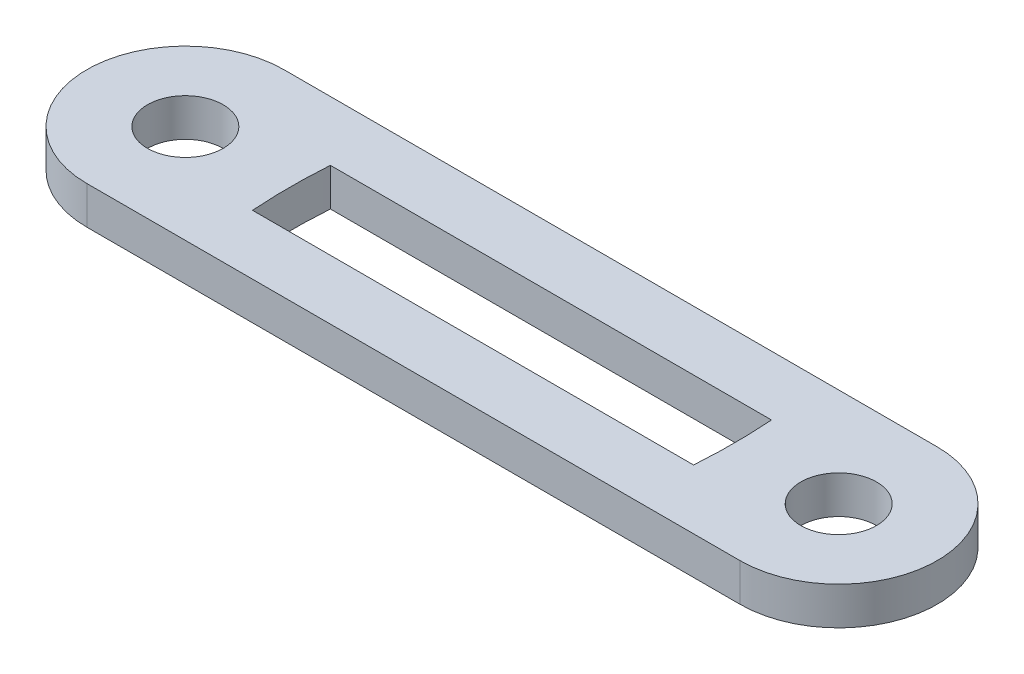
ISO-10303-21;
HEADER;
FILE_DESCRIPTION(('STEP AP214'),'2;1');
FILE_NAME('part.step','',(''),(''),'','','');
FILE_SCHEMA(('AUTOMOTIVE_DESIGN { 1 0 10303 214 1 1 1 1 }'));
ENDSEC;
DATA;
#1=APPLICATION_CONTEXT('core data for automotive mechanical design processes');
#2=APPLICATION_PROTOCOL_DEFINITION('international standard','automotive_design',2000,#1);
#3=PRODUCT_CONTEXT('',#1,'mechanical');
#4=PRODUCT('Part','Part','',(#3));
#5=PRODUCT_RELATED_PRODUCT_CATEGORY('part','',(#4));
#6=PRODUCT_DEFINITION_FORMATION('','',#4);
#7=PRODUCT_DEFINITION_CONTEXT('part definition',#1,'design');
#8=PRODUCT_DEFINITION('design','',#6,#7);
#9=PRODUCT_DEFINITION_SHAPE('','',#8);
#10=(LENGTH_UNIT() NAMED_UNIT(*) SI_UNIT(.MILLI.,.METRE.));
#11=(NAMED_UNIT(*) PLANE_ANGLE_UNIT() SI_UNIT($,.RADIAN.));
#12=(NAMED_UNIT(*) SI_UNIT($,.STERADIAN.) SOLID_ANGLE_UNIT());
#13=UNCERTAINTY_MEASURE_WITH_UNIT(LENGTH_MEASURE(1.E-05),#10,'distance_accuracy_value','');
#14=(GEOMETRIC_REPRESENTATION_CONTEXT(3) GLOBAL_UNCERTAINTY_ASSIGNED_CONTEXT((#13)) GLOBAL_UNIT_ASSIGNED_CONTEXT((#10,
#11,#12)) REPRESENTATION_CONTEXT('',''));
#15=CARTESIAN_POINT('',(0.,0.,0.));
#16=DIRECTION('',(0.,0.,1.));
#17=DIRECTION('',(1.,0.,0.));
#18=AXIS2_PLACEMENT_3D('',#15,#16,#17);
#19=CARTESIAN_POINT('',(0.,0.79375,4.13373631574243));
#20=DIRECTION('',(0.,0.,-1.));
#21=DIRECTION('',(-1.,0.,0.));
#22=AXIS2_PLACEMENT_3D('',#19,#20,#21);
#23=PLANE('',#22);
#24=DIRECTION('',(1.,0.,0.));
#25=VECTOR('',#24,1.);
#26=CARTESIAN_POINT('',(0.,-0.79375,4.13373631574243));
#27=LINE('',#26,#25);
#28=CARTESIAN_POINT('',(-13.7,-0.79375,4.13373631574243));
#29=VERTEX_POINT('',#28);
#30=CARTESIAN_POINT('',(13.7,-0.79375,4.13373631574243));
#31=VERTEX_POINT('',#30);
#32=EDGE_CURVE('E146',#29,#31,#27,.T.);
#33=ORIENTED_EDGE('',*,*,#32,.T.);
#34=DIRECTION('',(0.,-1.,0.));
#35=VECTOR('',#34,1.);
#36=CARTESIAN_POINT('',(13.7,0.79375,4.13373631574243));
#37=LINE('',#36,#35);
#38=CARTESIAN_POINT('',(13.7,0.79375,4.13373631574243));
#39=VERTEX_POINT('',#38);
#40=EDGE_CURVE('E11',#39,#31,#37,.T.);
#41=ORIENTED_EDGE('',*,*,#40,.F.);
#42=DIRECTION('',(1.,0.,0.));
#43=VECTOR('',#42,1.);
#44=CARTESIAN_POINT('',(0.,0.79375,4.13373631574243));
#45=LINE('',#44,#43);
#46=CARTESIAN_POINT('',(-13.7,0.79375,4.13373631574243));
#47=VERTEX_POINT('',#46);
#48=EDGE_CURVE('E116',#47,#39,#45,.T.);
#49=ORIENTED_EDGE('',*,*,#48,.F.);
#50=DIRECTION('',(0.,-1.,0.));
#51=VECTOR('',#50,1.);
#52=CARTESIAN_POINT('',(-13.7,0.79375,4.13373631574243));
#53=LINE('',#52,#51);
#54=EDGE_CURVE('E153',#47,#29,#53,.T.);
#55=ORIENTED_EDGE('',*,*,#54,.T.);
#56=EDGE_LOOP('',(#33,#41,#49,#55));
#57=FACE_BOUND('',#56,.T.);
#58=ADVANCED_FACE('F35',(#57),#23,.F.);
#59=CARTESIAN_POINT('',(13.7,0.79375,0.));
#60=DIRECTION('',(0.,-1.,0.));
#61=DIRECTION('',(0.,0.,-1.));
#62=AXIS2_PLACEMENT_3D('',#59,#60,#61);
#63=CYLINDRICAL_SURFACE('',#62,4.13373631574243);
#64=CARTESIAN_POINT('',(13.7,-0.79375,0.));
#65=DIRECTION('',(0.,1.,0.));
#66=DIRECTION('',(0.,0.,1.));
#67=AXIS2_PLACEMENT_3D('',#64,#65,#66);
#68=CIRCLE('',#67,4.13373631574243);
#69=CARTESIAN_POINT('',(13.7,-0.79375,-4.13373631574243));
#70=VERTEX_POINT('',#69);
#71=EDGE_CURVE('E121',#31,#70,#68,.T.);
#72=ORIENTED_EDGE('',*,*,#71,.T.);
#73=DIRECTION('',(0.,-1.,0.));
#74=VECTOR('',#73,1.);
#75=CARTESIAN_POINT('',(13.7,0.79375,-4.13373631574243));
#76=LINE('',#75,#74);
#77=CARTESIAN_POINT('',(13.7,0.79375,-4.13373631574243));
#78=VERTEX_POINT('',#77);
#79=EDGE_CURVE('E45',#78,#70,#76,.T.);
#80=ORIENTED_EDGE('',*,*,#79,.F.);
#81=CARTESIAN_POINT('',(13.7,0.79375,0.));
#82=DIRECTION('',(0.,1.,0.));
#83=DIRECTION('',(0.,0.,1.));
#84=AXIS2_PLACEMENT_3D('',#81,#82,#83);
#85=CIRCLE('',#84,4.13373631574243);
#86=EDGE_CURVE('E110',#39,#78,#85,.T.);
#87=ORIENTED_EDGE('',*,*,#86,.F.);
#88=ORIENTED_EDGE('',*,*,#40,.T.);
#89=EDGE_LOOP('',(#72,#80,#87,#88));
#90=FACE_BOUND('',#89,.T.);
#91=ADVANCED_FACE('F120',(#90),#63,.T.);
#92=CARTESIAN_POINT('',(0.,0.79375,-4.13373631574243));
#93=DIRECTION('',(0.,0.,1.));
#94=DIRECTION('',(1.,0.,0.));
#95=AXIS2_PLACEMENT_3D('',#92,#93,#94);
#96=PLANE('',#95);
#97=DIRECTION('',(-1.,0.,0.));
#98=VECTOR('',#97,1.);
#99=CARTESIAN_POINT('',(0.,-0.79375,-4.13373631574243));
#100=LINE('',#99,#98);
#101=CARTESIAN_POINT('',(-13.7,-0.79375,-4.13373631574243));
#102=VERTEX_POINT('',#101);
#103=EDGE_CURVE('E83',#70,#102,#100,.T.);
#104=ORIENTED_EDGE('',*,*,#103,.T.);
#105=DIRECTION('',(0.,-1.,0.));
#106=VECTOR('',#105,1.);
#107=CARTESIAN_POINT('',(-13.7,0.79375,-4.13373631574243));
#108=LINE('',#107,#106);
#109=CARTESIAN_POINT('',(-13.7,0.79375,-4.13373631574243));
#110=VERTEX_POINT('',#109);
#111=EDGE_CURVE('E122',#110,#102,#108,.T.);
#112=ORIENTED_EDGE('',*,*,#111,.F.);
#113=DIRECTION('',(-1.,0.,0.));
#114=VECTOR('',#113,1.);
#115=CARTESIAN_POINT('',(0.,0.79375,-4.13373631574243));
#116=LINE('',#115,#114);
#117=EDGE_CURVE('E114',#78,#110,#116,.T.);
#118=ORIENTED_EDGE('',*,*,#117,.F.);
#119=ORIENTED_EDGE('',*,*,#79,.T.);
#120=EDGE_LOOP('',(#104,#112,#118,#119));
#121=FACE_BOUND('',#120,.T.);
#122=ADVANCED_FACE('F124',(#121),#96,.F.);
#123=CARTESIAN_POINT('',(13.7,0.79375,0.));
#124=DIRECTION('',(0.,-1.,0.));
#125=DIRECTION('',(0.,0.,-1.));
#126=AXIS2_PLACEMENT_3D('',#123,#124,#125);
#127=CYLINDRICAL_SURFACE('',#126,23.0074229450913);
#128=CARTESIAN_POINT('',(13.7,-0.79375,0.));
#129=DIRECTION('',(0.,1.,0.));
#130=DIRECTION('',(0.,0.,1.));
#131=AXIS2_PLACEMENT_3D('',#128,#129,#130);
#132=CIRCLE('',#131,23.0074229450913);
#133=CARTESIAN_POINT('',(-9.24934457070484,-0.79375,-1.63373631574243));
#134=VERTEX_POINT('',#133);
#135=CARTESIAN_POINT('',(-9.24934457070484,-0.79375,1.63373631574243));
#136=VERTEX_POINT('',#135);
#137=EDGE_CURVE('E130',#134,#136,#132,.T.);
#138=ORIENTED_EDGE('',*,*,#137,.F.);
#139=DIRECTION('',(0.,-1.,0.));
#140=VECTOR('',#139,1.);
#141=CARTESIAN_POINT('',(-9.24934457070484,0.79375,-1.63373631574243));
#142=LINE('',#141,#140);
#143=CARTESIAN_POINT('',(-9.24934457070484,0.79375,-1.63373631574243));
#144=VERTEX_POINT('',#143);
#145=EDGE_CURVE('E39',#144,#134,#142,.T.);
#146=ORIENTED_EDGE('',*,*,#145,.F.);
#147=CARTESIAN_POINT('',(13.7,0.79375,0.));
#148=DIRECTION('',(0.,1.,0.));
#149=DIRECTION('',(0.,0.,1.));
#150=AXIS2_PLACEMENT_3D('',#147,#148,#149);
#151=CIRCLE('',#150,23.0074229450913);
#152=CARTESIAN_POINT('',(-9.24934457070484,0.79375,1.63373631574243));
#153=VERTEX_POINT('',#152);
#154=EDGE_CURVE('E152',#144,#153,#151,.T.);
#155=ORIENTED_EDGE('',*,*,#154,.T.);
#156=DIRECTION('',(0.,-1.,0.));
#157=VECTOR('',#156,1.);
#158=CARTESIAN_POINT('',(-9.24934457070484,0.79375,1.63373631574243));
#159=LINE('',#158,#157);
#160=EDGE_CURVE('E126',#153,#136,#159,.T.);
#161=ORIENTED_EDGE('',*,*,#160,.T.);
#162=EDGE_LOOP('',(#138,#146,#155,#161));
#163=FACE_BOUND('',#162,.T.);
#164=ADVANCED_FACE('F37',(#163),#127,.F.);
#165=CARTESIAN_POINT('',(0.,0.79375,-1.63373631574243));
#166=DIRECTION('',(0.,0.,-1.));
#167=DIRECTION('',(-1.,0.,0.));
#168=AXIS2_PLACEMENT_3D('',#165,#166,#167);
#169=PLANE('',#168);
#170=DIRECTION('',(1.,0.,0.));
#171=VECTOR('',#170,1.);
#172=CARTESIAN_POINT('',(0.,-0.79375,-1.63373631574243));
#173=LINE('',#172,#171);
#174=CARTESIAN_POINT('',(9.24934457070484,-0.79375,-1.63373631574243));
#175=VERTEX_POINT('',#174);
#176=EDGE_CURVE('E133',#134,#175,#173,.T.);
#177=ORIENTED_EDGE('',*,*,#176,.T.);
#178=DIRECTION('',(0.,-1.,0.));
#179=VECTOR('',#178,1.);
#180=CARTESIAN_POINT('',(9.24934457070484,0.79375,-1.63373631574243));
#181=LINE('',#180,#179);
#182=CARTESIAN_POINT('',(9.24934457070484,0.79375,-1.63373631574243));
#183=VERTEX_POINT('',#182);
#184=EDGE_CURVE('E159',#183,#175,#181,.T.);
#185=ORIENTED_EDGE('',*,*,#184,.F.);
#186=DIRECTION('',(1.,0.,0.));
#187=VECTOR('',#186,1.);
#188=CARTESIAN_POINT('',(0.,0.79375,-1.63373631574243));
#189=LINE('',#188,#187);
#190=EDGE_CURVE('E168',#144,#183,#189,.T.);
#191=ORIENTED_EDGE('',*,*,#190,.F.);
#192=ORIENTED_EDGE('',*,*,#145,.T.);
#193=EDGE_LOOP('',(#177,#185,#191,#192));
#194=FACE_BOUND('',#193,.T.);
#195=ADVANCED_FACE('F167',(#194),#169,.F.);
#196=CARTESIAN_POINT('',(-13.7,0.79375,0.));
#197=DIRECTION('',(0.,-1.,0.));
#198=DIRECTION('',(0.,0.,-1.));
#199=AXIS2_PLACEMENT_3D('',#196,#197,#198);
#200=CYLINDRICAL_SURFACE('',#199,23.0074229450913);
#201=CARTESIAN_POINT('',(-13.7,-0.79375,0.));
#202=DIRECTION('',(0.,1.,0.));
#203=DIRECTION('',(0.,0.,1.));
#204=AXIS2_PLACEMENT_3D('',#201,#202,#203);
#205=CIRCLE('',#204,23.0074229450913);
#206=CARTESIAN_POINT('',(9.24934457070484,-0.79375,1.63373631574243));
#207=VERTEX_POINT('',#206);
#208=EDGE_CURVE('E135',#175,#207,#205,.F.);
#209=ORIENTED_EDGE('',*,*,#208,.T.);
#210=DIRECTION('',(0.,-1.,0.));
#211=VECTOR('',#210,1.);
#212=CARTESIAN_POINT('',(9.24934457070484,0.79375,1.63373631574243));
#213=LINE('',#212,#211);
#214=CARTESIAN_POINT('',(9.24934457070484,0.79375,1.63373631574243));
#215=VERTEX_POINT('',#214);
#216=EDGE_CURVE('E157',#215,#207,#213,.T.);
#217=ORIENTED_EDGE('',*,*,#216,.F.);
#218=CARTESIAN_POINT('',(-13.7,0.79375,0.));
#219=DIRECTION('',(0.,1.,0.));
#220=DIRECTION('',(0.,0.,1.));
#221=AXIS2_PLACEMENT_3D('',#218,#219,#220);
#222=CIRCLE('',#221,23.0074229450913);
#223=EDGE_CURVE('E181',#183,#215,#222,.F.);
#224=ORIENTED_EDGE('',*,*,#223,.F.);
#225=ORIENTED_EDGE('',*,*,#184,.T.);
#226=EDGE_LOOP('',(#209,#217,#224,#225));
#227=FACE_BOUND('',#226,.T.);
#228=ADVANCED_FACE('F180',(#227),#200,.F.);
#229=CARTESIAN_POINT('',(-13.7,0.79375,0.));
#230=DIRECTION('',(0.,-1.,0.));
#231=DIRECTION('',(0.,0.,-1.));
#232=AXIS2_PLACEMENT_3D('',#229,#230,#231);
#233=CYLINDRICAL_SURFACE('',#232,1.5875);
#234=CARTESIAN_POINT('',(-13.7,0.79375,0.));
#235=DIRECTION('',(0.,1.,0.));
#236=DIRECTION('',(0.,0.,1.));
#237=AXIS2_PLACEMENT_3D('',#234,#235,#236);
#238=CIRCLE('',#237,1.5875);
#239=CARTESIAN_POINT('',(-13.7,0.79375,1.5875));
#240=VERTEX_POINT('',#239);
#241=EDGE_CURVE('E191',#240,#240,#238,.T.);
#242=ORIENTED_EDGE('',*,*,#241,.T.);
#243=EDGE_LOOP('',(#242));
#244=FACE_BOUND('',#243,.T.);
#245=CARTESIAN_POINT('',(-13.7,-0.79375,0.));
#246=DIRECTION('',(0.,1.,0.));
#247=DIRECTION('',(0.,0.,1.));
#248=AXIS2_PLACEMENT_3D('',#245,#246,#247);
#249=CIRCLE('',#248,1.5875);
#250=CARTESIAN_POINT('',(-13.7,-0.79375,1.5875));
#251=VERTEX_POINT('',#250);
#252=EDGE_CURVE('E143',#251,#251,#249,.T.);
#253=ORIENTED_EDGE('',*,*,#252,.F.);
#254=EDGE_LOOP('',(#253));
#255=FACE_BOUND('',#254,.T.);
#256=ADVANCED_FACE('F195',(#244,#255),#233,.F.);
#257=CARTESIAN_POINT('',(13.7,0.79375,0.));
#258=DIRECTION('',(0.,-1.,0.));
#259=DIRECTION('',(0.,0.,-1.));
#260=AXIS2_PLACEMENT_3D('',#257,#258,#259);
#261=CYLINDRICAL_SURFACE('',#260,1.5875);
#262=CARTESIAN_POINT('',(13.7,0.79375,0.));
#263=DIRECTION('',(0.,1.,0.));
#264=DIRECTION('',(0.,0.,1.));
#265=AXIS2_PLACEMENT_3D('',#262,#263,#264);
#266=CIRCLE('',#265,1.5875);
#267=CARTESIAN_POINT('',(13.7,0.79375,1.58749999999999));
#268=VERTEX_POINT('',#267);
#269=EDGE_CURVE('E184',#268,#268,#266,.T.);
#270=ORIENTED_EDGE('',*,*,#269,.T.);
#271=EDGE_LOOP('',(#270));
#272=FACE_BOUND('',#271,.T.);
#273=CARTESIAN_POINT('',(13.7,-0.79375,0.));
#274=DIRECTION('',(0.,1.,0.));
#275=DIRECTION('',(0.,0.,1.));
#276=AXIS2_PLACEMENT_3D('',#273,#274,#275);
#277=CIRCLE('',#276,1.5875);
#278=CARTESIAN_POINT('',(13.7,-0.79375,1.58749999999999));
#279=VERTEX_POINT('',#278);
#280=EDGE_CURVE('E140',#279,#279,#277,.T.);
#281=ORIENTED_EDGE('',*,*,#280,.F.);
#282=EDGE_LOOP('',(#281));
#283=FACE_BOUND('',#282,.T.);
#284=ADVANCED_FACE('F219',(#272,#283),#261,.F.);
#285=CARTESIAN_POINT('',(0.,0.79375,1.63373631574243));
#286=DIRECTION('',(0.,0.,1.));
#287=DIRECTION('',(1.,0.,0.));
#288=AXIS2_PLACEMENT_3D('',#285,#286,#287);
#289=PLANE('',#288);
#290=DIRECTION('',(-1.,0.,0.));
#291=VECTOR('',#290,1.);
#292=CARTESIAN_POINT('',(0.,-0.79375,1.63373631574243));
#293=LINE('',#292,#291);
#294=EDGE_CURVE('E137',#207,#136,#293,.T.);
#295=ORIENTED_EDGE('',*,*,#294,.T.);
#296=ORIENTED_EDGE('',*,*,#160,.F.);
#297=DIRECTION('',(-1.,0.,0.));
#298=VECTOR('',#297,1.);
#299=CARTESIAN_POINT('',(0.,0.79375,1.63373631574243));
#300=LINE('',#299,#298);
#301=EDGE_CURVE('E179',#215,#153,#300,.T.);
#302=ORIENTED_EDGE('',*,*,#301,.F.);
#303=ORIENTED_EDGE('',*,*,#216,.T.);
#304=EDGE_LOOP('',(#295,#296,#302,#303));
#305=FACE_BOUND('',#304,.T.);
#306=ADVANCED_FACE('F177',(#305),#289,.F.);
#307=CARTESIAN_POINT('',(-13.7,0.79375,0.));
#308=DIRECTION('',(0.,-1.,0.));
#309=DIRECTION('',(0.,0.,-1.));
#310=AXIS2_PLACEMENT_3D('',#307,#308,#309);
#311=CYLINDRICAL_SURFACE('',#310,4.13373631574243);
#312=CARTESIAN_POINT('',(-13.7,-0.79375,0.));
#313=DIRECTION('',(0.,1.,0.));
#314=DIRECTION('',(0.,0.,1.));
#315=AXIS2_PLACEMENT_3D('',#312,#313,#314);
#316=CIRCLE('',#315,4.13373631574243);
#317=EDGE_CURVE('E89',#102,#29,#316,.T.);
#318=ORIENTED_EDGE('',*,*,#317,.T.);
#319=ORIENTED_EDGE('',*,*,#54,.F.);
#320=CARTESIAN_POINT('',(-13.7,0.79375,0.));
#321=DIRECTION('',(0.,1.,0.));
#322=DIRECTION('',(0.,0.,1.));
#323=AXIS2_PLACEMENT_3D('',#320,#321,#322);
#324=CIRCLE('',#323,4.13373631574243);
#325=EDGE_CURVE('E54',#110,#47,#324,.T.);
#326=ORIENTED_EDGE('',*,*,#325,.F.);
#327=ORIENTED_EDGE('',*,*,#111,.T.);
#328=EDGE_LOOP('',(#318,#319,#326,#327));
#329=FACE_BOUND('',#328,.T.);
#330=ADVANCED_FACE('F199',(#329),#311,.T.);
#331=CARTESIAN_POINT('',(0.,0.79375,0.));
#332=DIRECTION('',(0.,1.,0.));
#333=DIRECTION('',(0.,0.,1.));
#334=AXIS2_PLACEMENT_3D('',#331,#332,#333);
#335=PLANE('',#334);
#336=ORIENTED_EDGE('',*,*,#154,.F.);
#337=ORIENTED_EDGE('',*,*,#190,.T.);
#338=ORIENTED_EDGE('',*,*,#223,.T.);
#339=ORIENTED_EDGE('',*,*,#301,.T.);
#340=EDGE_LOOP('',(#336,#337,#338,#339));
#341=FACE_BOUND('',#340,.T.);
#342=ORIENTED_EDGE('',*,*,#269,.F.);
#343=EDGE_LOOP('',(#342));
#344=FACE_BOUND('',#343,.T.);
#345=ORIENTED_EDGE('',*,*,#241,.F.);
#346=EDGE_LOOP('',(#345));
#347=FACE_BOUND('',#346,.T.);
#348=ORIENTED_EDGE('',*,*,#48,.T.);
#349=ORIENTED_EDGE('',*,*,#86,.T.);
#350=ORIENTED_EDGE('',*,*,#117,.T.);
#351=ORIENTED_EDGE('',*,*,#325,.T.);
#352=EDGE_LOOP('',(#348,#349,#350,#351));
#353=FACE_BOUND('',#352,.T.);
#354=ADVANCED_FACE('F112',(#341,#344,#347,#353),#335,.T.);
#355=CARTESIAN_POINT('',(0.,-0.79375,0.));
#356=DIRECTION('',(0.,1.,0.));
#357=DIRECTION('',(0.,0.,1.));
#358=AXIS2_PLACEMENT_3D('',#355,#356,#357);
#359=PLANE('',#358);
#360=ORIENTED_EDGE('',*,*,#137,.T.);
#361=ORIENTED_EDGE('',*,*,#294,.F.);
#362=ORIENTED_EDGE('',*,*,#208,.F.);
#363=ORIENTED_EDGE('',*,*,#176,.F.);
#364=EDGE_LOOP('',(#360,#361,#362,#363));
#365=FACE_BOUND('',#364,.T.);
#366=ORIENTED_EDGE('',*,*,#280,.T.);
#367=EDGE_LOOP('',(#366));
#368=FACE_BOUND('',#367,.T.);
#369=ORIENTED_EDGE('',*,*,#252,.T.);
#370=EDGE_LOOP('',(#369));
#371=FACE_BOUND('',#370,.T.);
#372=ORIENTED_EDGE('',*,*,#32,.F.);
#373=ORIENTED_EDGE('',*,*,#317,.F.);
#374=ORIENTED_EDGE('',*,*,#103,.F.);
#375=ORIENTED_EDGE('',*,*,#71,.F.);
#376=EDGE_LOOP('',(#372,#373,#374,#375));
#377=FACE_BOUND('',#376,.T.);
#378=ADVANCED_FACE('F171',(#365,#368,#371,#377),#359,.F.);
#379=CLOSED_SHELL('',(#58,#91,#122,#164,#195,#228,#256,#284,#306,#330,#354,#378));
#380=MANIFOLD_SOLID_BREP('B2',#379);
#381=ADVANCED_BREP_SHAPE_REPRESENTATION('',(#18,#380),#14);
#382=SHAPE_DEFINITION_REPRESENTATION(#9,#381);
ENDSEC;
END-ISO-10303-21;
